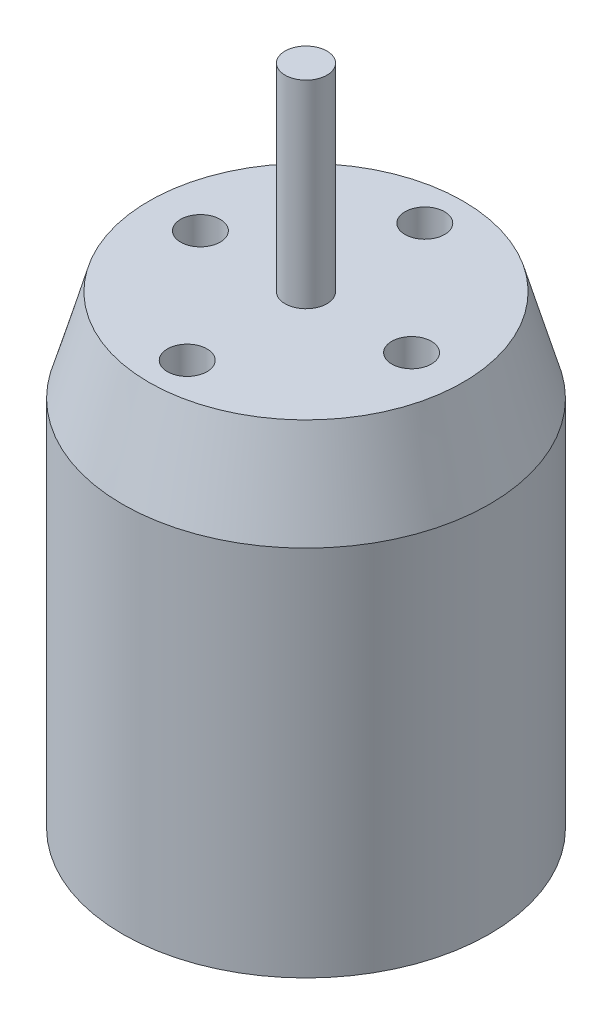
ISO-10303-21;
HEADER;
FILE_DESCRIPTION(('STEP AP214'),'2;1');
FILE_NAME('part.step','',(''),(''),'','','');
FILE_SCHEMA(('AUTOMOTIVE_DESIGN { 1 0 10303 214 1 1 1 1 }'));
ENDSEC;
DATA;
#1=APPLICATION_CONTEXT('core data for automotive mechanical design processes');
#2=APPLICATION_PROTOCOL_DEFINITION('international standard','automotive_design',2000,#1);
#3=PRODUCT_CONTEXT('',#1,'mechanical');
#4=PRODUCT('Part','Part','',(#3));
#5=PRODUCT_RELATED_PRODUCT_CATEGORY('part','',(#4));
#6=PRODUCT_DEFINITION_FORMATION('','',#4);
#7=PRODUCT_DEFINITION_CONTEXT('part definition',#1,'design');
#8=PRODUCT_DEFINITION('design','',#6,#7);
#9=PRODUCT_DEFINITION_SHAPE('','',#8);
#10=(LENGTH_UNIT() NAMED_UNIT(*) SI_UNIT(.MILLI.,.METRE.));
#11=(NAMED_UNIT(*) PLANE_ANGLE_UNIT() SI_UNIT($,.RADIAN.));
#12=(NAMED_UNIT(*) SI_UNIT($,.STERADIAN.) SOLID_ANGLE_UNIT());
#13=UNCERTAINTY_MEASURE_WITH_UNIT(LENGTH_MEASURE(1.E-05),#10,'distance_accuracy_value','');
#14=(GEOMETRIC_REPRESENTATION_CONTEXT(3) GLOBAL_UNCERTAINTY_ASSIGNED_CONTEXT((#13)) GLOBAL_UNIT_ASSIGNED_CONTEXT((#10,
#11,#12)) REPRESENTATION_CONTEXT('',''));
#15=CARTESIAN_POINT('',(0.,0.,0.));
#16=DIRECTION('',(0.,0.,1.));
#17=DIRECTION('',(1.,0.,0.));
#18=AXIS2_PLACEMENT_3D('',#15,#16,#17);
#19=CARTESIAN_POINT('',(0.,35.2,0.));
#20=DIRECTION('',(0.,-1.,0.));
#21=DIRECTION('',(0.,0.,-1.));
#22=AXIS2_PLACEMENT_3D('',#19,#20,#21);
#23=CYLINDRICAL_SURFACE('',#22,13.9);
#24=CARTESIAN_POINT('',(0.,28.2,0.));
#25=DIRECTION('',(0.,1.,0.));
#26=DIRECTION('',(0.,0.,1.));
#27=AXIS2_PLACEMENT_3D('',#24,#25,#26);
#28=CIRCLE('',#27,13.9);
#29=CARTESIAN_POINT('',(0.,28.2,-13.9));
#30=VERTEX_POINT('',#29);
#31=EDGE_CURVE('E44',#30,#30,#28,.F.);
#32=ORIENTED_EDGE('',*,*,#31,.T.);
#33=EDGE_LOOP('',(#32));
#34=FACE_BOUND('',#33,.T.);
#35=CARTESIAN_POINT('',(0.,0.,0.));
#36=DIRECTION('',(0.,1.,0.));
#37=DIRECTION('',(0.,0.,1.));
#38=AXIS2_PLACEMENT_3D('',#35,#36,#37);
#39=CIRCLE('',#38,13.9);
#40=CARTESIAN_POINT('',(0.,0.,13.9));
#41=VERTEX_POINT('',#40);
#42=EDGE_CURVE('E84',#41,#41,#39,.T.);
#43=ORIENTED_EDGE('',*,*,#42,.T.);
#44=EDGE_LOOP('',(#43));
#45=FACE_BOUND('',#44,.T.);
#46=ADVANCED_FACE('F39',(#34,#45),#23,.T.);
#47=CARTESIAN_POINT('',(0.,35.2,0.));
#48=DIRECTION('',(0.,1.,0.));
#49=DIRECTION('',(0.,0.,1.));
#50=AXIS2_PLACEMENT_3D('',#47,#48,#49);
#51=PLANE('',#50);
#52=CARTESIAN_POINT('',(0.,35.2,0.));
#53=DIRECTION('',(0.,1.,0.));
#54=DIRECTION('',(0.,0.,1.));
#55=AXIS2_PLACEMENT_3D('',#52,#53,#54);
#56=CIRCLE('',#55,11.9);
#57=CARTESIAN_POINT('',(0.,35.2,-11.9));
#58=VERTEX_POINT('',#57);
#59=EDGE_CURVE('E52',#58,#58,#56,.T.);
#60=ORIENTED_EDGE('',*,*,#59,.T.);
#61=EDGE_LOOP('',(#60));
#62=FACE_BOUND('',#61,.T.);
#63=CARTESIAN_POINT('',(0.,35.2,-9.));
#64=DIRECTION('',(0.,1.,0.));
#65=DIRECTION('',(0.,0.,1.));
#66=AXIS2_PLACEMENT_3D('',#63,#64,#65);
#67=CIRCLE('',#66,1.5);
#68=CARTESIAN_POINT('',(0.,35.2,-7.5));
#69=VERTEX_POINT('',#68);
#70=EDGE_CURVE('E60',#69,#69,#67,.T.);
#71=ORIENTED_EDGE('',*,*,#70,.F.);
#72=EDGE_LOOP('',(#71));
#73=FACE_BOUND('',#72,.T.);
#74=CARTESIAN_POINT('',(-8.,35.2,0.));
#75=DIRECTION('',(0.,1.,0.));
#76=DIRECTION('',(0.,0.,1.));
#77=AXIS2_PLACEMENT_3D('',#74,#75,#76);
#78=CIRCLE('',#77,1.5);
#79=CARTESIAN_POINT('',(-8.,35.2,1.5));
#80=VERTEX_POINT('',#79);
#81=EDGE_CURVE('E63',#80,#80,#78,.T.);
#82=ORIENTED_EDGE('',*,*,#81,.F.);
#83=EDGE_LOOP('',(#82));
#84=FACE_BOUND('',#83,.T.);
#85=CARTESIAN_POINT('',(8.,35.2,0.));
#86=DIRECTION('',(0.,1.,0.));
#87=DIRECTION('',(0.,0.,1.));
#88=AXIS2_PLACEMENT_3D('',#85,#86,#87);
#89=CIRCLE('',#88,1.5);
#90=CARTESIAN_POINT('',(8.,35.2,1.5));
#91=VERTEX_POINT('',#90);
#92=EDGE_CURVE('E69',#91,#91,#89,.T.);
#93=ORIENTED_EDGE('',*,*,#92,.F.);
#94=EDGE_LOOP('',(#93));
#95=FACE_BOUND('',#94,.T.);
#96=CARTESIAN_POINT('',(0.,35.2,9.));
#97=DIRECTION('',(0.,1.,0.));
#98=DIRECTION('',(0.,0.,1.));
#99=AXIS2_PLACEMENT_3D('',#96,#97,#98);
#100=CIRCLE('',#99,1.5);
#101=CARTESIAN_POINT('',(0.,35.2,10.5));
#102=VERTEX_POINT('',#101);
#103=EDGE_CURVE('E75',#102,#102,#100,.T.);
#104=ORIENTED_EDGE('',*,*,#103,.F.);
#105=EDGE_LOOP('',(#104));
#106=FACE_BOUND('',#105,.T.);
#107=CARTESIAN_POINT('',(0.,35.2,0.));
#108=DIRECTION('',(0.,1.,0.));
#109=DIRECTION('',(0.,0.,1.));
#110=AXIS2_PLACEMENT_3D('',#107,#108,#109);
#111=CIRCLE('',#110,1.585);
#112=CARTESIAN_POINT('',(0.,35.2,1.585));
#113=VERTEX_POINT('',#112);
#114=EDGE_CURVE('E59',#113,#113,#111,.T.);
#115=ORIENTED_EDGE('',*,*,#114,.F.);
#116=EDGE_LOOP('',(#115));
#117=FACE_BOUND('',#116,.T.);
#118=ADVANCED_FACE('F91',(#62,#73,#84,#95,#106,#117),#51,.T.);
#119=CARTESIAN_POINT('',(0.,0.,0.));
#120=DIRECTION('',(0.,1.,0.));
#121=DIRECTION('',(0.,0.,1.));
#122=AXIS2_PLACEMENT_3D('',#119,#120,#121);
#123=PLANE('',#122);
#124=CARTESIAN_POINT('',(0.,0.,0.));
#125=DIRECTION('',(0.,-1.,0.));
#126=DIRECTION('',(0.,0.,-1.));
#127=AXIS2_PLACEMENT_3D('',#124,#125,#126);
#128=CIRCLE('',#127,4.5);
#129=CARTESIAN_POINT('',(0.,0.,-4.5));
#130=VERTEX_POINT('',#129);
#131=EDGE_CURVE('E10',#130,#130,#128,.T.);
#132=ORIENTED_EDGE('',*,*,#131,.F.);
#133=EDGE_LOOP('',(#132));
#134=FACE_BOUND('',#133,.T.);
#135=ORIENTED_EDGE('',*,*,#42,.F.);
#136=EDGE_LOOP('',(#135));
#137=FACE_BOUND('',#136,.T.);
#138=ADVANCED_FACE('F115',(#134,#137),#123,.F.);
#139=CARTESIAN_POINT('',(0.,50.2,0.));
#140=DIRECTION('',(0.,-1.,0.));
#141=DIRECTION('',(0.,0.,-1.));
#142=AXIS2_PLACEMENT_3D('',#139,#140,#141);
#143=CYLINDRICAL_SURFACE('',#142,1.585);
#144=CARTESIAN_POINT('',(0.,50.2,0.));
#145=DIRECTION('',(0.,1.,0.));
#146=DIRECTION('',(0.,0.,1.));
#147=AXIS2_PLACEMENT_3D('',#144,#145,#146);
#148=CIRCLE('',#147,1.585);
#149=CARTESIAN_POINT('',(0.,50.2,1.585));
#150=VERTEX_POINT('',#149);
#151=EDGE_CURVE('E81',#150,#150,#148,.T.);
#152=ORIENTED_EDGE('',*,*,#151,.F.);
#153=EDGE_LOOP('',(#152));
#154=FACE_BOUND('',#153,.T.);
#155=ORIENTED_EDGE('',*,*,#114,.T.);
#156=EDGE_LOOP('',(#155));
#157=FACE_BOUND('',#156,.T.);
#158=ADVANCED_FACE('F119',(#154,#157),#143,.T.);
#159=CARTESIAN_POINT('',(0.,50.2,0.));
#160=DIRECTION('',(0.,1.,0.));
#161=DIRECTION('',(0.,0.,1.));
#162=AXIS2_PLACEMENT_3D('',#159,#160,#161);
#163=PLANE('',#162);
#164=ORIENTED_EDGE('',*,*,#151,.T.);
#165=EDGE_LOOP('',(#164));
#166=FACE_BOUND('',#165,.T.);
#167=ADVANCED_FACE('F124',(#166),#163,.T.);
#168=CARTESIAN_POINT('',(0.,28.2,9.));
#169=DIRECTION('',(0.,1.,0.));
#170=DIRECTION('',(0.,0.,1.));
#171=AXIS2_PLACEMENT_3D('',#168,#169,#170);
#172=CYLINDRICAL_SURFACE('',#171,1.5);
#173=CARTESIAN_POINT('',(0.,28.2,9.));
#174=DIRECTION('',(0.,1.,0.));
#175=DIRECTION('',(0.,0.,1.));
#176=AXIS2_PLACEMENT_3D('',#173,#174,#175);
#177=CIRCLE('',#176,1.5);
#178=CARTESIAN_POINT('',(0.,28.2,10.5));
#179=VERTEX_POINT('',#178);
#180=EDGE_CURVE('E78',#179,#179,#177,.T.);
#181=ORIENTED_EDGE('',*,*,#180,.F.);
#182=EDGE_LOOP('',(#181));
#183=FACE_BOUND('',#182,.T.);
#184=ORIENTED_EDGE('',*,*,#103,.T.);
#185=EDGE_LOOP('',(#184));
#186=FACE_BOUND('',#185,.T.);
#187=ADVANCED_FACE('F128',(#183,#186),#172,.F.);
#188=CARTESIAN_POINT('',(0.,28.2,9.));
#189=DIRECTION('',(0.,1.,0.));
#190=DIRECTION('',(0.,0.,1.));
#191=AXIS2_PLACEMENT_3D('',#188,#189,#190);
#192=PLANE('',#191);
#193=ORIENTED_EDGE('',*,*,#180,.T.);
#194=EDGE_LOOP('',(#193));
#195=FACE_BOUND('',#194,.T.);
#196=ADVANCED_FACE('F130',(#195),#192,.T.);
#197=CARTESIAN_POINT('',(8.,28.2,0.));
#198=DIRECTION('',(0.,1.,0.));
#199=DIRECTION('',(0.,0.,1.));
#200=AXIS2_PLACEMENT_3D('',#197,#198,#199);
#201=CYLINDRICAL_SURFACE('',#200,1.5);
#202=CARTESIAN_POINT('',(8.,28.2,0.));
#203=DIRECTION('',(0.,1.,0.));
#204=DIRECTION('',(0.,0.,1.));
#205=AXIS2_PLACEMENT_3D('',#202,#203,#204);
#206=CIRCLE('',#205,1.5);
#207=CARTESIAN_POINT('',(8.,28.2,1.5));
#208=VERTEX_POINT('',#207);
#209=EDGE_CURVE('E72',#208,#208,#206,.T.);
#210=ORIENTED_EDGE('',*,*,#209,.F.);
#211=EDGE_LOOP('',(#210));
#212=FACE_BOUND('',#211,.T.);
#213=ORIENTED_EDGE('',*,*,#92,.T.);
#214=EDGE_LOOP('',(#213));
#215=FACE_BOUND('',#214,.T.);
#216=ADVANCED_FACE('F133',(#212,#215),#201,.F.);
#217=CARTESIAN_POINT('',(8.,28.2,0.));
#218=DIRECTION('',(0.,1.,0.));
#219=DIRECTION('',(0.,0.,1.));
#220=AXIS2_PLACEMENT_3D('',#217,#218,#219);
#221=PLANE('',#220);
#222=ORIENTED_EDGE('',*,*,#209,.T.);
#223=EDGE_LOOP('',(#222));
#224=FACE_BOUND('',#223,.T.);
#225=ADVANCED_FACE('F138',(#224),#221,.T.);
#226=CARTESIAN_POINT('',(-8.,28.2,0.));
#227=DIRECTION('',(0.,1.,0.));
#228=DIRECTION('',(0.,0.,1.));
#229=AXIS2_PLACEMENT_3D('',#226,#227,#228);
#230=CYLINDRICAL_SURFACE('',#229,1.5);
#231=CARTESIAN_POINT('',(-8.,28.2,0.));
#232=DIRECTION('',(0.,1.,0.));
#233=DIRECTION('',(0.,0.,1.));
#234=AXIS2_PLACEMENT_3D('',#231,#232,#233);
#235=CIRCLE('',#234,1.5);
#236=CARTESIAN_POINT('',(-8.,28.2,1.5));
#237=VERTEX_POINT('',#236);
#238=EDGE_CURVE('E66',#237,#237,#235,.T.);
#239=ORIENTED_EDGE('',*,*,#238,.F.);
#240=EDGE_LOOP('',(#239));
#241=FACE_BOUND('',#240,.T.);
#242=ORIENTED_EDGE('',*,*,#81,.T.);
#243=EDGE_LOOP('',(#242));
#244=FACE_BOUND('',#243,.T.);
#245=ADVANCED_FACE('F141',(#241,#244),#230,.F.);
#246=CARTESIAN_POINT('',(-8.,28.2,0.));
#247=DIRECTION('',(0.,1.,0.));
#248=DIRECTION('',(0.,0.,1.));
#249=AXIS2_PLACEMENT_3D('',#246,#247,#248);
#250=PLANE('',#249);
#251=ORIENTED_EDGE('',*,*,#238,.T.);
#252=EDGE_LOOP('',(#251));
#253=FACE_BOUND('',#252,.T.);
#254=ADVANCED_FACE('F146',(#253),#250,.T.);
#255=CARTESIAN_POINT('',(0.,28.2,-9.));
#256=DIRECTION('',(0.,1.,0.));
#257=DIRECTION('',(0.,0.,1.));
#258=AXIS2_PLACEMENT_3D('',#255,#256,#257);
#259=CYLINDRICAL_SURFACE('',#258,1.5);
#260=CARTESIAN_POINT('',(0.,28.2,-9.));
#261=DIRECTION('',(0.,1.,0.));
#262=DIRECTION('',(0.,0.,1.));
#263=AXIS2_PLACEMENT_3D('',#260,#261,#262);
#264=CIRCLE('',#263,1.5);
#265=CARTESIAN_POINT('',(0.,28.2,-7.5));
#266=VERTEX_POINT('',#265);
#267=EDGE_CURVE('E56',#266,#266,#264,.T.);
#268=ORIENTED_EDGE('',*,*,#267,.F.);
#269=EDGE_LOOP('',(#268));
#270=FACE_BOUND('',#269,.T.);
#271=ORIENTED_EDGE('',*,*,#70,.T.);
#272=EDGE_LOOP('',(#271));
#273=FACE_BOUND('',#272,.T.);
#274=ADVANCED_FACE('F107',(#270,#273),#259,.F.);
#275=CARTESIAN_POINT('',(0.,28.2,-9.));
#276=DIRECTION('',(0.,1.,0.));
#277=DIRECTION('',(0.,0.,1.));
#278=AXIS2_PLACEMENT_3D('',#275,#276,#277);
#279=PLANE('',#278);
#280=ORIENTED_EDGE('',*,*,#267,.T.);
#281=EDGE_LOOP('',(#280));
#282=FACE_BOUND('',#281,.T.);
#283=ADVANCED_FACE('F96',(#282),#279,.T.);
#284=CARTESIAN_POINT('',(0.,35.2,0.));
#285=DIRECTION('',(0.,-1.,0.));
#286=DIRECTION('',(0.,0.,-1.));
#287=AXIS2_PLACEMENT_3D('',#284,#285,#286);
#288=CONICAL_SURFACE('',#287,11.9,0.278299659005109);
#289=CARTESIAN_POINT('',(0.,28.2,-13.9));
#290=CARTESIAN_POINT('',(0.,28.2729166666666,-13.8791666666667));
#291=CARTESIAN_POINT('',(0.,28.3458333333333,-13.8583333333333));
#292=CARTESIAN_POINT('',(0.,28.4916666666667,-13.8166666666667));
#293=CARTESIAN_POINT('',(0.,28.5645833333333,-13.7958333333333));
#294=CARTESIAN_POINT('',(0.,28.7104166666667,-13.7541666666667));
#295=CARTESIAN_POINT('',(0.,28.7833333333333,-13.7333333333333));
#296=CARTESIAN_POINT('',(0.,28.9291666666667,-13.6916666666667));
#297=CARTESIAN_POINT('',(0.,29.0020833333333,-13.6708333333333));
#298=CARTESIAN_POINT('',(0.,29.1479166666667,-13.6291666666667));
#299=CARTESIAN_POINT('',(0.,29.2208333333333,-13.6083333333333));
#300=CARTESIAN_POINT('',(0.,29.3666666666667,-13.5666666666667));
#301=CARTESIAN_POINT('',(0.,29.4395833333333,-13.5458333333333));
#302=CARTESIAN_POINT('',(0.,29.5854166666667,-13.5041666666667));
#303=CARTESIAN_POINT('',(0.,29.6583333333333,-13.4833333333333));
#304=CARTESIAN_POINT('',(0.,29.8041666666667,-13.4416666666667));
#305=CARTESIAN_POINT('',(0.,29.8770833333333,-13.4208333333333));
#306=CARTESIAN_POINT('',(0.,30.0229166666667,-13.3791666666667));
#307=CARTESIAN_POINT('',(0.,30.0958333333333,-13.3583333333333));
#308=CARTESIAN_POINT('',(0.,30.2416666666667,-13.3166666666667));
#309=CARTESIAN_POINT('',(0.,30.3145833333333,-13.2958333333333));
#310=CARTESIAN_POINT('',(0.,30.4604166666667,-13.2541666666667));
#311=CARTESIAN_POINT('',(0.,30.5333333333333,-13.2333333333333));
#312=CARTESIAN_POINT('',(0.,30.6791666666667,-13.1916666666667));
#313=CARTESIAN_POINT('',(0.,30.7520833333333,-13.1708333333333));
#314=CARTESIAN_POINT('',(0.,30.8979166666667,-13.1291666666667));
#315=CARTESIAN_POINT('',(0.,30.9708333333333,-13.1083333333333));
#316=CARTESIAN_POINT('',(0.,31.1166666666667,-13.0666666666667));
#317=CARTESIAN_POINT('',(0.,31.1895833333333,-13.0458333333333));
#318=CARTESIAN_POINT('',(0.,31.3354166666667,-13.0041666666667));
#319=CARTESIAN_POINT('',(0.,31.4083333333333,-12.9833333333333));
#320=CARTESIAN_POINT('',(0.,31.5541666666667,-12.9416666666667));
#321=CARTESIAN_POINT('',(0.,31.6270833333333,-12.9208333333333));
#322=CARTESIAN_POINT('',(0.,31.7729166666667,-12.8791666666667));
#323=CARTESIAN_POINT('',(0.,31.8458333333333,-12.8583333333333));
#324=CARTESIAN_POINT('',(0.,31.9916666666667,-12.8166666666667));
#325=CARTESIAN_POINT('',(0.,32.0645833333333,-12.7958333333333));
#326=CARTESIAN_POINT('',(0.,32.2104166666667,-12.7541666666667));
#327=CARTESIAN_POINT('',(0.,32.2833333333333,-12.7333333333333));
#328=CARTESIAN_POINT('',(0.,32.4291666666667,-12.6916666666667));
#329=CARTESIAN_POINT('',(0.,32.5020833333333,-12.6708333333333));
#330=CARTESIAN_POINT('',(0.,32.6479166666667,-12.6291666666667));
#331=CARTESIAN_POINT('',(0.,32.7208333333333,-12.6083333333333));
#332=CARTESIAN_POINT('',(0.,32.8666666666667,-12.5666666666667));
#333=CARTESIAN_POINT('',(0.,32.9395833333333,-12.5458333333333));
#334=CARTESIAN_POINT('',(0.,33.0854166666667,-12.5041666666667));
#335=CARTESIAN_POINT('',(0.,33.1583333333333,-12.4833333333333));
#336=CARTESIAN_POINT('',(0.,33.3041666666667,-12.4416666666667));
#337=CARTESIAN_POINT('',(0.,33.3770833333333,-12.4208333333333));
#338=CARTESIAN_POINT('',(0.,33.5229166666667,-12.3791666666667));
#339=CARTESIAN_POINT('',(0.,33.5958333333333,-12.3583333333333));
#340=CARTESIAN_POINT('',(0.,33.7416666666667,-12.3166666666667));
#341=CARTESIAN_POINT('',(0.,33.8145833333333,-12.2958333333334));
#342=CARTESIAN_POINT('',(0.,33.9604166666667,-12.2541666666667));
#343=CARTESIAN_POINT('',(0.,34.0333333333333,-12.2333333333334));
#344=CARTESIAN_POINT('',(0.,34.1791666666667,-12.1916666666667));
#345=CARTESIAN_POINT('',(0.,34.2520833333333,-12.1708333333334));
#346=CARTESIAN_POINT('',(0.,34.3979166666667,-12.1291666666667));
#347=CARTESIAN_POINT('',(0.,34.4708333333333,-12.1083333333334));
#348=CARTESIAN_POINT('',(0.,34.6166666666667,-12.0666666666667));
#349=CARTESIAN_POINT('',(0.,34.6895833333333,-12.0458333333334));
#350=CARTESIAN_POINT('',(0.,34.8354166666667,-12.0041666666667));
#351=CARTESIAN_POINT('',(0.,34.9083333333333,-11.9833333333334));
#352=CARTESIAN_POINT('',(0.,35.0541666666667,-11.9416666666667));
#353=CARTESIAN_POINT('',(0.,35.1270833333333,-11.9208333333334));
#354=CARTESIAN_POINT('',(0.,35.2,-11.9));
#355=B_SPLINE_CURVE_WITH_KNOTS('',3,(#289,#290,#291,#292,#293,#294,#295,#296,#297,#298,#299,
#300,#301,#302,#303,#304,#305,#306,#307,#308,#309,#310,#311,#312,#313,#314,#315,#316,#317,#318,
#319,#320,#321,#322,#323,#324,#325,#326,#327,#328,#329,#330,#331,#332,#333,#334,#335,#336,#337,
#338,#339,#340,#341,#342,#343,#344,#345,#346,#347,#348,#349,#350,#351,#352,#353,#354),
.UNSPECIFIED.,.F.,.F.,(4,2,2,2,2,2,2,2,2,2,2,2,2,2,2,2,2,2,2,2,2,2,2,2,2,2,2,2,2,2,2,2,4),(0.,
0.227503434040016,0.455006868080033,0.682510302120049,0.910013736160068,1.13751717020008,
1.3650206042401,1.59252403828012,1.82002747232013,2.04753090636015,2.27503434040017,
2.50253777444018,2.7300412084802,2.95754464252021,3.18504807656023,3.41255151060025,
3.64005494464026,3.86755837868028,4.0950618127203,4.32256524676032,4.55006868080033,
4.77757211484035,5.00507554888036,5.23257898292038,5.46008241696039,5.68758585100041,
5.91508928504043,6.14259271908045,6.37009615312046,6.59759958716048,6.8251030212005,
7.05260645524051,7.28010988928053),.UNSPECIFIED.);
#356=EDGE_CURVE('BSEAM42',#30,#58,#355,.T.);
#357=ORIENTED_EDGE('',*,*,#31,.F.);
#358=ORIENTED_EDGE('',*,*,#59,.F.);
#359=ORIENTED_EDGE('',*,*,#356,.T.);
#360=ORIENTED_EDGE('',*,*,#356,.F.);
#361=EDGE_LOOP('',(#357,#359,#358,#360));
#362=FACE_BOUND('',#361,.T.);
#363=ADVANCED_FACE('F42',(#362),#288,.T.);
#364=CARTESIAN_POINT('',(0.,-5.,0.));
#365=DIRECTION('',(0.,1.,0.));
#366=DIRECTION('',(0.,0.,1.));
#367=AXIS2_PLACEMENT_3D('',#364,#365,#366);
#368=CYLINDRICAL_SURFACE('',#367,4.5);
#369=CARTESIAN_POINT('',(0.,-5.,0.));
#370=DIRECTION('',(0.,-1.,0.));
#371=DIRECTION('',(0.,0.,-1.));
#372=AXIS2_PLACEMENT_3D('',#369,#370,#371);
#373=CIRCLE('',#372,4.5);
#374=CARTESIAN_POINT('',(0.,-5.,-4.5));
#375=VERTEX_POINT('',#374);
#376=EDGE_CURVE('E55',#375,#375,#373,.T.);
#377=ORIENTED_EDGE('',*,*,#376,.F.);
#378=EDGE_LOOP('',(#377));
#379=FACE_BOUND('',#378,.T.);
#380=ORIENTED_EDGE('',*,*,#131,.T.);
#381=EDGE_LOOP('',(#380));
#382=FACE_BOUND('',#381,.T.);
#383=ADVANCED_FACE('F95',(#379,#382),#368,.T.);
#384=CARTESIAN_POINT('',(0.,-5.,0.));
#385=DIRECTION('',(0.,-1.,0.));
#386=DIRECTION('',(0.,0.,-1.));
#387=AXIS2_PLACEMENT_3D('',#384,#385,#386);
#388=PLANE('',#387);
#389=ORIENTED_EDGE('',*,*,#376,.T.);
#390=EDGE_LOOP('',(#389));
#391=FACE_BOUND('',#390,.T.);
#392=ADVANCED_FACE('F103',(#391),#388,.T.);
#393=CLOSED_SHELL('',(#46,#118,#138,#158,#167,#187,#196,#216,#225,#245,#254,#274,#283,#363,#383,#392));
#394=MANIFOLD_SOLID_BREP('B2',#393);
#395=ADVANCED_BREP_SHAPE_REPRESENTATION('',(#18,#394),#14);
#396=SHAPE_DEFINITION_REPRESENTATION(#9,#395);
ENDSEC;
END-ISO-10303-21;
